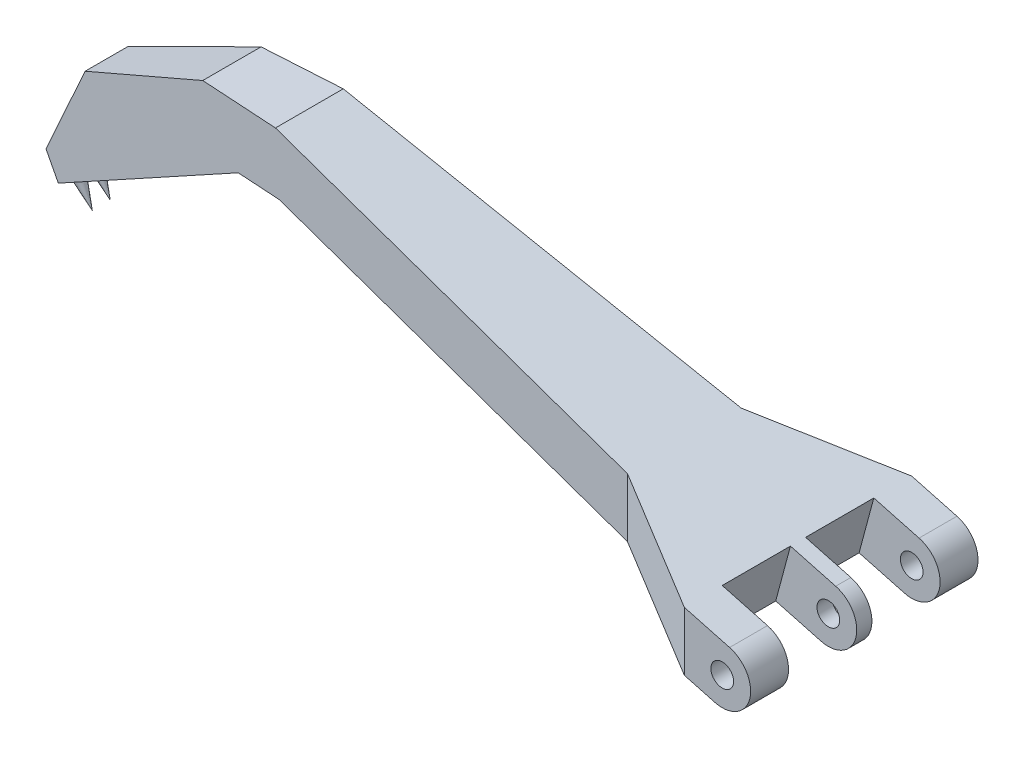
ISO-10303-21;
HEADER;
FILE_DESCRIPTION(('STEP AP214'),'2;1');
FILE_NAME('part.step','',(''),(''),'','','');
FILE_SCHEMA(('AUTOMOTIVE_DESIGN { 1 0 10303 214 1 1 1 1 }'));
ENDSEC;
DATA;
#1=APPLICATION_CONTEXT('core data for automotive mechanical design processes');
#2=APPLICATION_PROTOCOL_DEFINITION('international standard','automotive_design',2000,#1);
#3=PRODUCT_CONTEXT('',#1,'mechanical');
#4=PRODUCT('Part','Part','',(#3));
#5=PRODUCT_RELATED_PRODUCT_CATEGORY('part','',(#4));
#6=PRODUCT_DEFINITION_FORMATION('','',#4);
#7=PRODUCT_DEFINITION_CONTEXT('part definition',#1,'design');
#8=PRODUCT_DEFINITION('design','',#6,#7);
#9=PRODUCT_DEFINITION_SHAPE('','',#8);
#10=(LENGTH_UNIT() NAMED_UNIT(*) SI_UNIT(.MILLI.,.METRE.));
#11=(NAMED_UNIT(*) PLANE_ANGLE_UNIT() SI_UNIT($,.RADIAN.));
#12=(NAMED_UNIT(*) SI_UNIT($,.STERADIAN.) SOLID_ANGLE_UNIT());
#13=UNCERTAINTY_MEASURE_WITH_UNIT(LENGTH_MEASURE(1.E-05),#10,'distance_accuracy_value','');
#14=(GEOMETRIC_REPRESENTATION_CONTEXT(3) GLOBAL_UNCERTAINTY_ASSIGNED_CONTEXT((#13)) GLOBAL_UNIT_ASSIGNED_CONTEXT((#10,
#11,#12)) REPRESENTATION_CONTEXT('',''));
#15=CARTESIAN_POINT('',(0.,0.,0.));
#16=DIRECTION('',(0.,0.,1.));
#17=DIRECTION('',(1.,0.,0.));
#18=AXIS2_PLACEMENT_3D('',#15,#16,#17);
#19=CARTESIAN_POINT('',(0.,0.,15.));
#20=DIRECTION('',(0.,0.,-1.));
#21=DIRECTION('',(0.,1.,0.));
#22=AXIS2_PLACEMENT_3D('',#19,#20,#21);
#23=CYLINDRICAL_SURFACE('',#22,3.75);
#24=DIRECTION('',(0.,0.,-1.));
#25=VECTOR('',#24,1.);
#26=CARTESIAN_POINT('',(-0.970571419134456,-3.62222184858401,15.));
#27=LINE('',#26,#25);
#28=CARTESIAN_POINT('',(-0.970571419134456,-3.62222184858401,15.));
#29=VERTEX_POINT('',#28);
#30=CARTESIAN_POINT('',(-0.970571419134455,-3.622221848584,10.));
#31=VERTEX_POINT('',#30);
#32=EDGE_CURVE('E471',#29,#31,#27,.T.);
#33=ORIENTED_EDGE('',*,*,#32,.T.);
#34=CARTESIAN_POINT('',(0.,0.,10.));
#35=DIRECTION('',(0.,0.,1.));
#36=DIRECTION('',(1.,0.,0.));
#37=AXIS2_PLACEMENT_3D('',#34,#35,#36);
#38=CIRCLE('',#37,3.75);
#39=CARTESIAN_POINT('',(0.970571419134456,3.62222184858401,10.));
#40=VERTEX_POINT('',#39);
#41=EDGE_CURVE('E441',#31,#40,#38,.T.);
#42=ORIENTED_EDGE('',*,*,#41,.T.);
#43=DIRECTION('',(0.,0.,-1.));
#44=VECTOR('',#43,1.);
#45=CARTESIAN_POINT('',(0.970571419134455,3.622221848584,15.));
#46=LINE('',#45,#44);
#47=CARTESIAN_POINT('',(0.970571419134455,3.622221848584,15.));
#48=VERTEX_POINT('',#47);
#49=EDGE_CURVE('E466',#48,#40,#46,.T.);
#50=ORIENTED_EDGE('',*,*,#49,.F.);
#51=CARTESIAN_POINT('',(0.,0.,15.));
#52=DIRECTION('',(0.,0.,1.));
#53=DIRECTION('',(1.,0.,0.));
#54=AXIS2_PLACEMENT_3D('',#51,#52,#53);
#55=CIRCLE('',#54,3.75);
#56=EDGE_CURVE('E463',#29,#48,#55,.T.);
#57=ORIENTED_EDGE('',*,*,#56,.F.);
#58=EDGE_LOOP('',(#33,#42,#50,#57));
#59=FACE_BOUND('',#58,.T.);
#60=ADVANCED_FACE('F228',(#59),#23,.T.);
#61=CARTESIAN_POINT('',(0.,0.,-10.));
#62=DIRECTION('',(0.,0.,1.));
#63=DIRECTION('',(1.,0.,0.));
#64=AXIS2_PLACEMENT_3D('',#61,#62,#63);
#65=CIRCLE('',#64,3.75);
#66=CARTESIAN_POINT('',(-0.970571419134455,-3.622221848584,-10.));
#67=VERTEX_POINT('',#66);
#68=CARTESIAN_POINT('',(0.970571419134455,3.62222184858401,-10.));
#69=VERTEX_POINT('',#68);
#70=EDGE_CURVE('E434',#67,#69,#65,.T.);
#71=ORIENTED_EDGE('',*,*,#70,.F.);
#72=CARTESIAN_POINT('',(-0.970571419134456,-3.622221848584,-15.));
#73=VERTEX_POINT('',#72);
#74=EDGE_CURVE('E469',#67,#73,#27,.T.);
#75=ORIENTED_EDGE('',*,*,#74,.T.);
#76=CARTESIAN_POINT('',(0.,0.,-15.));
#77=DIRECTION('',(0.,0.,1.));
#78=DIRECTION('',(1.,0.,0.));
#79=AXIS2_PLACEMENT_3D('',#76,#77,#78);
#80=CIRCLE('',#79,3.75);
#81=CARTESIAN_POINT('',(0.970571419134455,3.62222184858401,-15.));
#82=VERTEX_POINT('',#81);
#83=EDGE_CURVE('E452',#73,#82,#80,.T.);
#84=ORIENTED_EDGE('',*,*,#83,.T.);
#85=EDGE_CURVE('E465',#69,#82,#46,.T.);
#86=ORIENTED_EDGE('',*,*,#85,.F.);
#87=EDGE_LOOP('',(#71,#75,#84,#86));
#88=FACE_BOUND('',#87,.T.);
#89=ADVANCED_FACE('F592',(#88),#23,.T.);
#90=CARTESIAN_POINT('',(0.,0.,15.));
#91=DIRECTION('',(0.,0.,-1.));
#92=DIRECTION('',(0.,1.,0.));
#93=AXIS2_PLACEMENT_3D('',#90,#91,#92);
#94=CYLINDRICAL_SURFACE('',#93,1.5);
#95=CARTESIAN_POINT('',(0.,0.,10.));
#96=DIRECTION('',(0.,0.,1.));
#97=DIRECTION('',(1.,0.,0.));
#98=AXIS2_PLACEMENT_3D('',#95,#96,#97);
#99=CIRCLE('',#98,1.5);
#100=CARTESIAN_POINT('',(1.5,0.,10.));
#101=VERTEX_POINT('',#100);
#102=EDGE_CURVE('E232',#101,#101,#99,.T.);
#103=ORIENTED_EDGE('',*,*,#102,.F.);
#104=EDGE_LOOP('',(#103));
#105=FACE_BOUND('',#104,.T.);
#106=CARTESIAN_POINT('',(0.,0.,15.));
#107=DIRECTION('',(0.,0.,1.));
#108=DIRECTION('',(1.,0.,0.));
#109=AXIS2_PLACEMENT_3D('',#106,#107,#108);
#110=CIRCLE('',#109,1.5);
#111=CARTESIAN_POINT('',(1.5,0.,15.));
#112=VERTEX_POINT('',#111);
#113=EDGE_CURVE('E455',#112,#112,#110,.T.);
#114=ORIENTED_EDGE('',*,*,#113,.T.);
#115=EDGE_LOOP('',(#114));
#116=FACE_BOUND('',#115,.T.);
#117=ADVANCED_FACE('F567',(#105,#116),#94,.F.);
#118=CARTESIAN_POINT('',(0.,0.,-15.));
#119=DIRECTION('',(0.,0.,1.));
#120=DIRECTION('',(1.,0.,0.));
#121=AXIS2_PLACEMENT_3D('',#118,#119,#120);
#122=CIRCLE('',#121,1.5);
#123=CARTESIAN_POINT('',(1.5,0.,-15.));
#124=VERTEX_POINT('',#123);
#125=EDGE_CURVE('E443',#124,#124,#122,.T.);
#126=ORIENTED_EDGE('',*,*,#125,.F.);
#127=EDGE_LOOP('',(#126));
#128=FACE_BOUND('',#127,.T.);
#129=CARTESIAN_POINT('',(0.,0.,-10.));
#130=DIRECTION('',(0.,0.,1.));
#131=DIRECTION('',(1.,0.,0.));
#132=AXIS2_PLACEMENT_3D('',#129,#130,#131);
#133=CIRCLE('',#132,1.5);
#134=CARTESIAN_POINT('',(1.5,0.,-10.));
#135=VERTEX_POINT('',#134);
#136=EDGE_CURVE('E402',#135,#135,#133,.T.);
#137=ORIENTED_EDGE('',*,*,#136,.T.);
#138=EDGE_LOOP('',(#137));
#139=FACE_BOUND('',#138,.T.);
#140=ADVANCED_FACE('F568',(#128,#139),#94,.F.);
#141=CARTESIAN_POINT('',(-68.9705714191345,14.5983232367324,-15.));
#142=DIRECTION('',(-0.258819045102521,-0.965925826289068,0.));
#143=DIRECTION('',(0.965925826289068,-0.258819045102521,0.));
#144=AXIS2_PLACEMENT_3D('',#141,#142,#143);
#145=PLANE('',#144);
#146=DIRECTION('',(0.965925826289068,-0.258819045102521,0.));
#147=VECTOR('',#146,1.);
#148=CARTESIAN_POINT('',(-0.970571419134447,-3.62222184858401,10.));
#149=LINE('',#148,#147);
#150=CARTESIAN_POINT('',(-6.94114283826891,-2.02241205847458,10.));
#151=VERTEX_POINT('',#150);
#152=EDGE_CURVE('E394',#151,#31,#149,.T.);
#153=ORIENTED_EDGE('',*,*,#152,.T.);
#154=ORIENTED_EDGE('',*,*,#32,.F.);
#155=DIRECTION('',(0.965925826289068,-0.258819045102524,0.));
#156=VECTOR('',#155,1.);
#157=CARTESIAN_POINT('',(-0.970571419134456,-3.62222184858401,15.));
#158=LINE('',#157,#156);
#159=CARTESIAN_POINT('',(-5.,-2.54253971438219,15.));
#160=VERTEX_POINT('',#159);
#161=EDGE_CURVE('E461',#160,#29,#158,.T.);
#162=ORIENTED_EDGE('',*,*,#161,.F.);
#163=DIRECTION('',(0.869796502294152,-0.233061270369134,0.434898251147076));
#164=VECTOR('',#163,1.);
#165=CARTESIAN_POINT('',(-68.2195914821881,14.3970987690956,-16.609795741094));
#166=LINE('',#165,#164);
#167=CARTESIAN_POINT('',(-20.,1.47669817208466,7.5));
#168=VERTEX_POINT('',#167);
#169=EDGE_CURVE('E492',#168,#160,#166,.T.);
#170=ORIENTED_EDGE('',*,*,#169,.F.);
#171=DIRECTION('',(0.964243845481214,-0.258368359703372,0.058988110291729));
#172=VECTOR('',#171,1.);
#173=CARTESIAN_POINT('',(-70.0799493099778,14.8955801466848,4.43633349370575));
#174=LINE('',#173,#172);
#175=CARTESIAN_POINT('',(-68.9705714191345,14.5983232367324,4.50420025343353));
#176=VERTEX_POINT('',#175);
#177=EDGE_CURVE('E528',#176,#168,#174,.T.);
#178=ORIENTED_EDGE('',*,*,#177,.F.);
#179=DIRECTION('',(0.,0.,1.));
#180=VECTOR('',#179,1.);
#181=CARTESIAN_POINT('',(-68.9705714191345,14.5983232367324,-15.));
#182=LINE('',#181,#180);
#183=CARTESIAN_POINT('',(-68.9705714191345,14.5983232367324,-4.50420025343353));
#184=VERTEX_POINT('',#183);
#185=EDGE_CURVE('E531',#184,#176,#182,.T.);
#186=ORIENTED_EDGE('',*,*,#185,.F.);
#187=DIRECTION('',(0.964243845481214,-0.258368359703372,-0.058988110291729));
#188=VECTOR('',#187,1.);
#189=CARTESIAN_POINT('',(-68.3735816408168,14.4383603077425,-4.54072140837942));
#190=LINE('',#189,#188);
#191=CARTESIAN_POINT('',(-20.,1.47669817208466,-7.5));
#192=VERTEX_POINT('',#191);
#193=EDGE_CURVE('E515',#184,#192,#190,.T.);
#194=ORIENTED_EDGE('',*,*,#193,.T.);
#195=DIRECTION('',(0.869796502294152,-0.233061270369134,-0.434898251147076));
#196=VECTOR('',#195,1.);
#197=CARTESIAN_POINT('',(-56.871402151141,11.3563606022861,10.9357010755705));
#198=LINE('',#197,#196);
#199=CARTESIAN_POINT('',(-5.,-2.54253971438218,-15.));
#200=VERTEX_POINT('',#199);
#201=EDGE_CURVE('E497',#192,#200,#198,.T.);
#202=ORIENTED_EDGE('',*,*,#201,.T.);
#203=DIRECTION('',(0.965925826289068,-0.258819045102524,0.));
#204=VECTOR('',#203,1.);
#205=CARTESIAN_POINT('',(-0.970571419134456,-3.622221848584,-15.));
#206=LINE('',#205,#204);
#207=EDGE_CURVE('E449',#200,#73,#206,.T.);
#208=ORIENTED_EDGE('',*,*,#207,.T.);
#209=ORIENTED_EDGE('',*,*,#74,.F.);
#210=DIRECTION('',(0.965925826289068,-0.258819045102521,0.));
#211=VECTOR('',#210,1.);
#212=CARTESIAN_POINT('',(-0.970571419134449,-3.62222184858401,-10.));
#213=LINE('',#212,#211);
#214=CARTESIAN_POINT('',(-6.94114283826892,-2.02241205847458,-10.));
#215=VERTEX_POINT('',#214);
#216=EDGE_CURVE('E389',#215,#67,#213,.T.);
#217=ORIENTED_EDGE('',*,*,#216,.F.);
#218=DIRECTION('',(0.,0.,1.));
#219=VECTOR('',#218,1.);
#220=CARTESIAN_POINT('',(-6.94114283826891,-2.02241205847458,0.));
#221=LINE('',#220,#219);
#222=CARTESIAN_POINT('',(-6.94114283826891,-2.02241205847458,-0.999999999999999));
#223=VERTEX_POINT('',#222);
#224=EDGE_CURVE('E418',#215,#223,#221,.T.);
#225=ORIENTED_EDGE('',*,*,#224,.T.);
#226=DIRECTION('',(0.965925826289068,-0.258819045102521,0.));
#227=VECTOR('',#226,1.);
#228=CARTESIAN_POINT('',(-0.970571419134448,-3.62222184858401,-0.999999999999999));
#229=LINE('',#228,#227);
#230=CARTESIAN_POINT('',(-0.970571419134455,-3.622221848584,-0.999999999999997));
#231=VERTEX_POINT('',#230);
#232=EDGE_CURVE('E429',#223,#231,#229,.T.);
#233=ORIENTED_EDGE('',*,*,#232,.T.);
#234=CARTESIAN_POINT('',(-0.970571419134456,-3.62222184858401,1.));
#235=VERTEX_POINT('',#234);
#236=EDGE_CURVE('E475',#235,#231,#27,.T.);
#237=ORIENTED_EDGE('',*,*,#236,.F.);
#238=DIRECTION('',(-0.965925826289068,0.258819045102521,0.));
#239=VECTOR('',#238,1.);
#240=CARTESIAN_POINT('',(-0.970571419134447,-3.62222184858401,1.));
#241=LINE('',#240,#239);
#242=CARTESIAN_POINT('',(-6.94114283826891,-2.02241205847458,1.));
#243=VERTEX_POINT('',#242);
#244=EDGE_CURVE('E406',#235,#243,#241,.T.);
#245=ORIENTED_EDGE('',*,*,#244,.T.);
#246=DIRECTION('',(0.,0.,-1.));
#247=VECTOR('',#246,1.);
#248=CARTESIAN_POINT('',(-6.94114283826891,-2.02241205847458,0.));
#249=LINE('',#248,#247);
#250=EDGE_CURVE('E398',#151,#243,#249,.T.);
#251=ORIENTED_EDGE('',*,*,#250,.F.);
#252=EDGE_LOOP('',(#153,#154,#162,#170,#178,#186,#194,#202,#208,#209,#217,#225,#233,#237,#245,#251));
#253=FACE_BOUND('',#252,.T.);
#254=ADVANCED_FACE('F585',(#253),#145,.T.);
#255=CARTESIAN_POINT('',(-74.7149624486662,14.5983232367324,-15.));
#256=DIRECTION('',(0.,-1.,0.));
#257=DIRECTION('',(0.,0.,-1.));
#258=AXIS2_PLACEMENT_3D('',#255,#256,#257);
#259=PLANE('',#258);
#260=DIRECTION('',(0.998134014285676,0.,0.0610613586973179));
#261=VECTOR('',#260,1.);
#262=CARTESIAN_POINT('',(-75.8822752134345,14.5983232367324,4.08137323967286));
#263=LINE('',#262,#261);
#264=CARTESIAN_POINT('',(-74.7149624486662,14.5983232367324,4.1527841949367));
#265=VERTEX_POINT('',#264);
#266=EDGE_CURVE('E526',#265,#176,#263,.T.);
#267=ORIENTED_EDGE('',*,*,#266,.F.);
#268=DIRECTION('',(0.,0.,1.));
#269=VECTOR('',#268,1.);
#270=CARTESIAN_POINT('',(-74.7149624486662,14.5983232367324,-15.));
#271=LINE('',#270,#269);
#272=CARTESIAN_POINT('',(-74.7149624486662,14.5983232367324,-4.1527841949367));
#273=VERTEX_POINT('',#272);
#274=EDGE_CURVE('E534',#273,#265,#271,.T.);
#275=ORIENTED_EDGE('',*,*,#274,.F.);
#276=DIRECTION('',(0.998134014285676,0.,-0.0610613586973179));
#277=VECTOR('',#276,1.);
#278=CARTESIAN_POINT('',(-74.0538526412058,14.5983232367324,-4.19322792545173));
#279=LINE('',#278,#277);
#280=EDGE_CURVE('E512',#273,#184,#279,.T.);
#281=ORIENTED_EDGE('',*,*,#280,.T.);
#282=ORIENTED_EDGE('',*,*,#185,.T.);
#283=EDGE_LOOP('',(#267,#275,#281,#282));
#284=FACE_BOUND('',#283,.T.);
#285=ADVANCED_FACE('F648',(#284),#259,.T.);
#286=CARTESIAN_POINT('',(-100.,0.,-15.));
#287=DIRECTION('',(0.500000000000001,-0.866025403784438,0.));
#288=DIRECTION('',(0.866025403784438,0.500000000000001,0.));
#289=AXIS2_PLACEMENT_3D('',#286,#287,#288);
#290=PLANE('',#289);
#291=CARTESIAN_POINT('',(-98.7009618943233,0.750000000000008,-1.18332476496804));
#292=DIRECTION('',(0.500000000000002,-0.866025403784438,0.));
#293=DIRECTION('',(0.866025403784438,0.500000000000002,0.));
#294=AXIS2_PLACEMENT_3D('',#291,#292,#293);
#295=CIRCLE('',#294,0.749999999999999);
#296=CARTESIAN_POINT('',(-98.051442841485,1.12500000000001,-1.18332476496804));
#297=VERTEX_POINT('',#296);
#298=EDGE_CURVE('E384',#297,#297,#295,.T.);
#299=ORIENTED_EDGE('',*,*,#298,.F.);
#300=EDGE_LOOP('',(#299));
#301=FACE_BOUND('',#300,.T.);
#302=CARTESIAN_POINT('',(-98.7009618943233,0.750000000000008,1.18332476496804));
#303=DIRECTION('',(0.500000000000002,-0.866025403784438,0.));
#304=DIRECTION('',(0.866025403784438,0.500000000000002,0.));
#305=AXIS2_PLACEMENT_3D('',#302,#303,#304);
#306=CIRCLE('',#305,0.749999999999999);
#307=CARTESIAN_POINT('',(-98.051442841485,1.12500000000001,1.18332476496804));
#308=VERTEX_POINT('',#307);
#309=EDGE_CURVE('E386',#308,#308,#306,.T.);
#310=ORIENTED_EDGE('',*,*,#309,.F.);
#311=EDGE_LOOP('',(#310));
#312=FACE_BOUND('',#311,.T.);
#313=DIRECTION('',(0.864812562293368,0.499299765638648,0.0529053507007609));
#314=VECTOR('',#313,1.);
#315=CARTESIAN_POINT('',(-100.805529177096,-0.465072487236377,2.5566804345002));
#316=LINE('',#315,#314);
#317=CARTESIAN_POINT('',(-100.,0.,2.60595909379827));
#318=VERTEX_POINT('',#317);
#319=EDGE_CURVE('E524',#318,#265,#316,.T.);
#320=ORIENTED_EDGE('',*,*,#319,.F.);
#321=DIRECTION('',(0.,0.,1.));
#322=VECTOR('',#321,1.);
#323=CARTESIAN_POINT('',(-100.,0.,-15.));
#324=LINE('',#323,#322);
#325=CARTESIAN_POINT('',(-100.,0.,-2.60595909379827));
#326=VERTEX_POINT('',#325);
#327=EDGE_CURVE('E537',#326,#318,#324,.T.);
#328=ORIENTED_EDGE('',*,*,#327,.F.);
#329=DIRECTION('',(0.864812562293368,0.499299765638648,-0.0529053507007609));
#330=VECTOR('',#329,1.);
#331=CARTESIAN_POINT('',(-99.4329328201392,0.327396388941235,-2.64064971848331));
#332=LINE('',#331,#330);
#333=EDGE_CURVE('E509',#326,#273,#332,.T.);
#334=ORIENTED_EDGE('',*,*,#333,.T.);
#335=ORIENTED_EDGE('',*,*,#274,.T.);
#336=EDGE_LOOP('',(#320,#328,#334,#335));
#337=FACE_BOUND('',#336,.T.);
#338=ADVANCED_FACE('F644',(#301,#312,#337),#290,.T.);
#339=CARTESIAN_POINT('',(-101.732050807569,3.,-15.));
#340=DIRECTION('',(-0.866025403784438,-0.500000000000002,0.));
#341=DIRECTION('',(0.500000000000002,-0.866025403784438,0.));
#342=AXIS2_PLACEMENT_3D('',#339,#340,#341);
#343=PLANE('',#342);
#344=DIRECTION('',(0.499766261304419,-0.865620556487993,0.0305734565795416));
#345=VECTOR('',#344,1.);
#346=CARTESIAN_POINT('',(-101.999443494142,3.46313771871753,2.48364211567363));
#347=LINE('',#346,#345);
#348=CARTESIAN_POINT('',(-101.732050807569,3.00000000000003,2.5));
#349=VERTEX_POINT('',#348);
#350=EDGE_CURVE('E522',#349,#318,#347,.T.);
#351=ORIENTED_EDGE('',*,*,#350,.F.);
#352=DIRECTION('',(0.,0.,1.));
#353=VECTOR('',#352,1.);
#354=CARTESIAN_POINT('',(-101.732050807569,3.,-15.));
#355=LINE('',#354,#353);
#356=CARTESIAN_POINT('',(-101.732050807569,3.,-2.5));
#357=VERTEX_POINT('',#356);
#358=EDGE_CURVE('E540',#357,#349,#355,.T.);
#359=ORIENTED_EDGE('',*,*,#358,.F.);
#360=DIRECTION('',(0.499766261304419,-0.865620556487993,-0.0305734565795416));
#361=VECTOR('',#360,1.);
#362=CARTESIAN_POINT('',(-101.541056031445,2.6691873437732,-2.51168420309026));
#363=LINE('',#362,#361);
#364=EDGE_CURVE('E506',#357,#326,#363,.T.);
#365=ORIENTED_EDGE('',*,*,#364,.T.);
#366=ORIENTED_EDGE('',*,*,#327,.T.);
#367=EDGE_LOOP('',(#351,#359,#365,#366));
#368=FACE_BOUND('',#367,.T.);
#369=ADVANCED_FACE('F641',(#368),#343,.T.);
#370=CARTESIAN_POINT('',(-96.2340080507036,14.790590741355,-15.));
#371=DIRECTION('',(-0.90630778703665,0.4226182617407,0.));
#372=DIRECTION('',(-0.4226182617407,-0.90630778703665,0.));
#373=AXIS2_PLACEMENT_3D('',#370,#371,#372);
#374=PLANE('',#373);
#375=DIRECTION('',(-0.422477088512507,-0.906005040071799,-0.0258452519139152));
#376=VECTOR('',#375,1.);
#377=CARTESIAN_POINT('',(-96.428763585724,14.3729361486963,2.82443130751307));
#378=LINE('',#377,#376);
#379=CARTESIAN_POINT('',(-96.2340080507036,14.790590741355,2.8363455769518));
#380=VERTEX_POINT('',#379);
#381=EDGE_CURVE('E520',#380,#349,#378,.T.);
#382=ORIENTED_EDGE('',*,*,#381,.F.);
#383=DIRECTION('',(0.,0.,1.));
#384=VECTOR('',#383,1.);
#385=CARTESIAN_POINT('',(-96.2340080507036,14.790590741355,-15.));
#386=LINE('',#385,#384);
#387=CARTESIAN_POINT('',(-96.2340080507036,14.790590741355,-2.83634557695181));
#388=VERTEX_POINT('',#387);
#389=EDGE_CURVE('E543',#388,#380,#386,.T.);
#390=ORIENTED_EDGE('',*,*,#389,.F.);
#391=DIRECTION('',(-0.422477088512507,-0.906005040071799,0.0258452519139152));
#392=VECTOR('',#391,1.);
#393=CARTESIAN_POINT('',(-96.1011927823101,15.0754140035743,-2.84447061890789));
#394=LINE('',#393,#392);
#395=EDGE_CURVE('E503',#388,#357,#394,.T.);
#396=ORIENTED_EDGE('',*,*,#395,.T.);
#397=ORIENTED_EDGE('',*,*,#358,.T.);
#398=EDGE_LOOP('',(#382,#390,#396,#397));
#399=FACE_BOUND('',#398,.T.);
#400=ADVANCED_FACE('F636',(#399),#374,.T.);
#401=CARTESIAN_POINT('',(-79.701126542499,22.5,-15.));
#402=DIRECTION('',(-0.422618261740701,0.906307787036649,0.));
#403=DIRECTION('',(-0.906307787036649,-0.422618261740701,0.));
#404=AXIS2_PLACEMENT_3D('',#401,#402,#403);
#405=PLANE('',#404);
#406=DIRECTION('',(-0.904917986450531,-0.421970187084086,-0.0553588205305825));
#407=VECTOR('',#406,1.);
#408=CARTESIAN_POINT('',(-80.6453083583222,22.059720788591,3.78999225156442));
#409=LINE('',#408,#407);
#410=CARTESIAN_POINT('',(-79.701126542499,22.5,3.84775305693355));
#411=VERTEX_POINT('',#410);
#412=EDGE_CURVE('E518',#411,#380,#409,.T.);
#413=ORIENTED_EDGE('',*,*,#412,.F.);
#414=DIRECTION('',(0.,0.,1.));
#415=VECTOR('',#414,1.);
#416=CARTESIAN_POINT('',(-79.701126542499,22.5,-15.));
#417=LINE('',#416,#415);
#418=CARTESIAN_POINT('',(-79.701126542499,22.5,-3.84775305693355));
#419=VERTEX_POINT('',#418);
#420=EDGE_CURVE('E546',#419,#411,#417,.T.);
#421=ORIENTED_EDGE('',*,*,#420,.F.);
#422=DIRECTION('',(-0.904917986450531,-0.421970187084086,0.0553588205305825));
#423=VECTOR('',#422,1.);
#424=CARTESIAN_POINT('',(-79.1424525861178,22.7605139442723,-3.88193022188054));
#425=LINE('',#424,#423);
#426=EDGE_CURVE('E500',#419,#388,#425,.T.);
#427=ORIENTED_EDGE('',*,*,#426,.T.);
#428=ORIENTED_EDGE('',*,*,#389,.T.);
#429=EDGE_LOOP('',(#413,#421,#427,#428));
#430=FACE_BOUND('',#429,.T.);
#431=ADVANCED_FACE('F633',(#430),#405,.T.);
#432=CARTESIAN_POINT('',(-69.4822557759636,22.5,-15.));
#433=DIRECTION('',(0.,1.,0.));
#434=DIRECTION('',(0.,0.,1.));
#435=AXIS2_PLACEMENT_3D('',#432,#433,#434);
#436=PLANE('',#435);
#437=DIRECTION('',(0.998134014285676,0.,0.0610613586973179));
#438=VECTOR('',#437,1.);
#439=CARTESIAN_POINT('',(-0.531675433576437,22.5,8.69098471004111));
#440=LINE('',#439,#438);
#441=CARTESIAN_POINT('',(-69.4822557759636,22.5,4.47289770126622));
#442=VERTEX_POINT('',#441);
#443=EDGE_CURVE('E474',#411,#442,#440,.T.);
#444=ORIENTED_EDGE('',*,*,#443,.T.);
#445=DIRECTION('',(0.,0.,1.));
#446=VECTOR('',#445,1.);
#447=CARTESIAN_POINT('',(-69.4822557759636,22.5,-15.));
#448=LINE('',#447,#446);
#449=CARTESIAN_POINT('',(-69.4822557759636,22.5,-4.47289770126622));
#450=VERTEX_POINT('',#449);
#451=EDGE_CURVE('E530',#450,#442,#448,.T.);
#452=ORIENTED_EDGE('',*,*,#451,.F.);
#453=DIRECTION('',(0.998134014285676,0.,-0.0610613586973179));
#454=VECTOR('',#453,1.);
#455=CARTESIAN_POINT('',(-0.531675433576437,22.5,-8.69098471004111));
#456=LINE('',#455,#454);
#457=EDGE_CURVE('E253',#419,#450,#456,.T.);
#458=ORIENTED_EDGE('',*,*,#457,.F.);
#459=ORIENTED_EDGE('',*,*,#420,.T.);
#460=EDGE_LOOP('',(#444,#452,#458,#459));
#461=FACE_BOUND('',#460,.T.);
#462=ADVANCED_FACE('F628',(#461),#436,.T.);
#463=CARTESIAN_POINT('',(0.970571419134455,3.62222184858401,-15.));
#464=DIRECTION('',(0.258819045102521,0.965925826289068,0.));
#465=DIRECTION('',(-0.965925826289068,0.258819045102521,0.));
#466=AXIS2_PLACEMENT_3D('',#463,#464,#465);
#467=PLANE('',#466);
#468=DIRECTION('',(0.965925826289068,-0.258819045102521,0.));
#469=VECTOR('',#468,1.);
#470=CARTESIAN_POINT('',(0.970571419134457,3.62222184858401,10.));
#471=LINE('',#470,#469);
#472=CARTESIAN_POINT('',(-5.00000000000001,5.22203163869343,10.));
#473=VERTEX_POINT('',#472);
#474=EDGE_CURVE('E395',#473,#40,#471,.T.);
#475=ORIENTED_EDGE('',*,*,#474,.F.);
#476=DIRECTION('',(0.,0.,-1.));
#477=VECTOR('',#476,1.);
#478=CARTESIAN_POINT('',(-5.,5.22203163869344,0.));
#479=LINE('',#478,#477);
#480=CARTESIAN_POINT('',(-5.00000000000001,5.22203163869343,1.));
#481=VERTEX_POINT('',#480);
#482=EDGE_CURVE('E399',#473,#481,#479,.T.);
#483=ORIENTED_EDGE('',*,*,#482,.T.);
#484=DIRECTION('',(-0.965925826289068,0.258819045102521,0.));
#485=VECTOR('',#484,1.);
#486=CARTESIAN_POINT('',(0.970571419134456,3.62222184858401,1.));
#487=LINE('',#486,#485);
#488=CARTESIAN_POINT('',(0.970571419134456,3.62222184858401,1.));
#489=VERTEX_POINT('',#488);
#490=EDGE_CURVE('E392',#489,#481,#487,.T.);
#491=ORIENTED_EDGE('',*,*,#490,.F.);
#492=CARTESIAN_POINT('',(0.970571419134456,3.62222184858401,-0.999999999999997));
#493=VERTEX_POINT('',#492);
#494=EDGE_CURVE('E470',#489,#493,#46,.T.);
#495=ORIENTED_EDGE('',*,*,#494,.T.);
#496=DIRECTION('',(0.965925826289068,-0.258819045102521,0.));
#497=VECTOR('',#496,1.);
#498=CARTESIAN_POINT('',(0.970571419134456,3.62222184858401,-0.999999999999999));
#499=LINE('',#498,#497);
#500=CARTESIAN_POINT('',(-5.00000000000001,5.22203163869343,-0.999999999999999));
#501=VERTEX_POINT('',#500);
#502=EDGE_CURVE('E415',#501,#493,#499,.T.);
#503=ORIENTED_EDGE('',*,*,#502,.F.);
#504=DIRECTION('',(0.,0.,1.));
#505=VECTOR('',#504,1.);
#506=CARTESIAN_POINT('',(-5.,5.22203163869344,0.));
#507=LINE('',#506,#505);
#508=CARTESIAN_POINT('',(-5.00000000000001,5.22203163869343,-10.));
#509=VERTEX_POINT('',#508);
#510=EDGE_CURVE('E419',#509,#501,#507,.T.);
#511=ORIENTED_EDGE('',*,*,#510,.F.);
#512=DIRECTION('',(0.965925826289068,-0.258819045102521,0.));
#513=VECTOR('',#512,1.);
#514=CARTESIAN_POINT('',(0.970571419134454,3.62222184858401,-10.));
#515=LINE('',#514,#513);
#516=EDGE_CURVE('E408',#509,#69,#515,.T.);
#517=ORIENTED_EDGE('',*,*,#516,.T.);
#518=ORIENTED_EDGE('',*,*,#85,.T.);
#519=DIRECTION('',(-0.965925826289068,0.258819045102522,0.));
#520=VECTOR('',#519,1.);
#521=CARTESIAN_POINT('',(0.970571419134455,3.62222184858401,-15.));
#522=LINE('',#521,#520);
#523=CARTESIAN_POINT('',(-5.,5.22203163869344,-15.));
#524=VERTEX_POINT('',#523);
#525=EDGE_CURVE('E446',#82,#524,#522,.T.);
#526=ORIENTED_EDGE('',*,*,#525,.T.);
#527=DIRECTION('',(-0.869796502294152,0.233061270369133,0.434898251147076));
#528=VECTOR('',#527,1.);
#529=CARTESIAN_POINT('',(-0.158681495513486,3.92480425511442,-17.4206592522433));
#530=LINE('',#529,#528);
#531=CARTESIAN_POINT('',(-20.,9.24126952516028,-7.5));
#532=VERTEX_POINT('',#531);
#533=EDGE_CURVE('E494',#524,#532,#530,.T.);
#534=ORIENTED_EDGE('',*,*,#533,.T.);
#535=DIRECTION('',(-0.964243845481214,0.258368359703372,0.058988110291729));
#536=VECTOR('',#535,1.);
#537=CARTESIAN_POINT('',(1.32419419575941,3.5274689111621,-8.80451848357295));
#538=LINE('',#537,#536);
#539=EDGE_CURVE('E237',#532,#450,#538,.T.);
#540=ORIENTED_EDGE('',*,*,#539,.T.);
#541=ORIENTED_EDGE('',*,*,#451,.T.);
#542=DIRECTION('',(-0.964243845481214,0.258368359703372,-0.058988110291729));
#543=VECTOR('',#542,1.);
#544=CARTESIAN_POINT('',(-0.382173473401592,3.98468875010437,8.70013056889928));
#545=LINE('',#544,#543);
#546=CARTESIAN_POINT('',(-20.,9.24126952516028,7.5));
#547=VERTEX_POINT('',#546);
#548=EDGE_CURVE('E13',#547,#442,#545,.T.);
#549=ORIENTED_EDGE('',*,*,#548,.F.);
#550=DIRECTION('',(-0.869796502294152,0.233061270369134,-0.434898251147076));
#551=VECTOR('',#550,1.);
#552=CARTESIAN_POINT('',(-11.5068708265606,6.96554242192397,11.7465645867197));
#553=LINE('',#552,#551);
#554=CARTESIAN_POINT('',(-5.,5.22203163869344,15.));
#555=VERTEX_POINT('',#554);
#556=EDGE_CURVE('E490',#555,#547,#553,.T.);
#557=ORIENTED_EDGE('',*,*,#556,.F.);
#558=DIRECTION('',(-0.965925826289068,0.258819045102522,0.));
#559=VECTOR('',#558,1.);
#560=CARTESIAN_POINT('',(0.970571419134455,3.622221848584,15.));
#561=LINE('',#560,#559);
#562=EDGE_CURVE('E458',#48,#555,#561,.T.);
#563=ORIENTED_EDGE('',*,*,#562,.F.);
#564=ORIENTED_EDGE('',*,*,#49,.T.);
#565=EDGE_LOOP('',(#475,#483,#491,#495,#503,#511,#517,#518,#526,#534,#540,#541,#549,#557,#563,#564));
#566=FACE_BOUND('',#565,.T.);
#567=ADVANCED_FACE('F230',(#566),#467,.T.);
#568=CARTESIAN_POINT('',(-0.531675433576437,22.5,8.69098471004111));
#569=DIRECTION('',(0.0610613586973179,0.,-0.998134014285676));
#570=DIRECTION('',(-0.998134014285676,0.,-0.0610613586973179));
#571=AXIS2_PLACEMENT_3D('',#568,#569,#570);
#572=PLANE('',#571);
#573=ORIENTED_EDGE('',*,*,#177,.T.);
#574=DIRECTION('',(0.,-1.,0.));
#575=VECTOR('',#574,1.);
#576=CARTESIAN_POINT('',(-20.,22.5,7.5));
#577=LINE('',#576,#575);
#578=EDGE_CURVE('E487',#547,#168,#577,.T.);
#579=ORIENTED_EDGE('',*,*,#578,.F.);
#580=ORIENTED_EDGE('',*,*,#548,.T.);
#581=ORIENTED_EDGE('',*,*,#443,.F.);
#582=ORIENTED_EDGE('',*,*,#412,.T.);
#583=ORIENTED_EDGE('',*,*,#381,.T.);
#584=ORIENTED_EDGE('',*,*,#350,.T.);
#585=ORIENTED_EDGE('',*,*,#319,.T.);
#586=ORIENTED_EDGE('',*,*,#266,.T.);
#587=EDGE_LOOP('',(#573,#579,#580,#581,#582,#583,#584,#585,#586));
#588=FACE_BOUND('',#587,.T.);
#589=ADVANCED_FACE('F625',(#588),#572,.F.);
#590=CARTESIAN_POINT('',(-7.,22.5,14.));
#591=DIRECTION('',(0.447213595499958,0.,-0.894427190999916));
#592=DIRECTION('',(-0.894427190999916,0.,-0.447213595499958));
#593=AXIS2_PLACEMENT_3D('',#590,#591,#592);
#594=PLANE('',#593);
#595=ORIENTED_EDGE('',*,*,#169,.T.);
#596=DIRECTION('',(0.,-1.,0.));
#597=VECTOR('',#596,1.);
#598=CARTESIAN_POINT('',(-5.,22.5,15.));
#599=LINE('',#598,#597);
#600=EDGE_CURVE('E484',#555,#160,#599,.T.);
#601=ORIENTED_EDGE('',*,*,#600,.F.);
#602=ORIENTED_EDGE('',*,*,#556,.T.);
#603=ORIENTED_EDGE('',*,*,#578,.T.);
#604=EDGE_LOOP('',(#595,#601,#602,#603));
#605=FACE_BOUND('',#604,.T.);
#606=ADVANCED_FACE('F620',(#605),#594,.F.);
#607=CARTESIAN_POINT('',(-7.,22.5,-14.));
#608=DIRECTION('',(-0.447213595499958,0.,-0.894427190999916));
#609=DIRECTION('',(-0.894427190999916,0.,0.447213595499958));
#610=AXIS2_PLACEMENT_3D('',#607,#608,#609);
#611=PLANE('',#610);
#612=DIRECTION('',(0.,-1.,0.));
#613=VECTOR('',#612,1.);
#614=CARTESIAN_POINT('',(-20.,22.5,-7.5));
#615=LINE('',#614,#613);
#616=EDGE_CURVE('E479',#532,#192,#615,.T.);
#617=ORIENTED_EDGE('',*,*,#616,.F.);
#618=ORIENTED_EDGE('',*,*,#533,.F.);
#619=DIRECTION('',(0.,-1.,0.));
#620=VECTOR('',#619,1.);
#621=CARTESIAN_POINT('',(-5.,22.5,-15.));
#622=LINE('',#621,#620);
#623=EDGE_CURVE('E482',#524,#200,#622,.T.);
#624=ORIENTED_EDGE('',*,*,#623,.T.);
#625=ORIENTED_EDGE('',*,*,#201,.F.);
#626=EDGE_LOOP('',(#617,#618,#624,#625));
#627=FACE_BOUND('',#626,.T.);
#628=ADVANCED_FACE('F653',(#627),#611,.T.);
#629=CARTESIAN_POINT('',(-0.531675433576437,22.5,-8.69098471004111));
#630=DIRECTION('',(-0.0610613586973179,0.,-0.998134014285676));
#631=DIRECTION('',(-0.998134014285676,0.,0.0610613586973179));
#632=AXIS2_PLACEMENT_3D('',#629,#630,#631);
#633=PLANE('',#632);
#634=ORIENTED_EDGE('',*,*,#280,.F.);
#635=ORIENTED_EDGE('',*,*,#333,.F.);
#636=ORIENTED_EDGE('',*,*,#364,.F.);
#637=ORIENTED_EDGE('',*,*,#395,.F.);
#638=ORIENTED_EDGE('',*,*,#426,.F.);
#639=ORIENTED_EDGE('',*,*,#457,.T.);
#640=ORIENTED_EDGE('',*,*,#539,.F.);
#641=ORIENTED_EDGE('',*,*,#616,.T.);
#642=ORIENTED_EDGE('',*,*,#193,.F.);
#643=EDGE_LOOP('',(#634,#635,#636,#637,#638,#639,#640,#641,#642));
#644=FACE_BOUND('',#643,.T.);
#645=ADVANCED_FACE('F650',(#644),#633,.T.);
#646=CARTESIAN_POINT('',(0.,0.,15.));
#647=DIRECTION('',(0.,0.,1.));
#648=DIRECTION('',(1.,0.,0.));
#649=AXIS2_PLACEMENT_3D('',#646,#647,#648);
#650=PLANE('',#649);
#651=ORIENTED_EDGE('',*,*,#562,.T.);
#652=ORIENTED_EDGE('',*,*,#600,.T.);
#653=ORIENTED_EDGE('',*,*,#161,.T.);
#654=ORIENTED_EDGE('',*,*,#56,.T.);
#655=EDGE_LOOP('',(#651,#652,#653,#654));
#656=FACE_BOUND('',#655,.T.);
#657=ORIENTED_EDGE('',*,*,#113,.F.);
#658=EDGE_LOOP('',(#657));
#659=FACE_BOUND('',#658,.T.);
#660=ADVANCED_FACE('F614',(#656,#659),#650,.T.);
#661=ORIENTED_EDGE('',*,*,#494,.F.);
#662=CARTESIAN_POINT('',(0.,0.,1.));
#663=DIRECTION('',(0.,0.,-1.));
#664=DIRECTION('',(-1.,0.,0.));
#665=AXIS2_PLACEMENT_3D('',#662,#663,#664);
#666=CIRCLE('',#665,3.75);
#667=EDGE_CURVE('E245',#489,#235,#666,.T.);
#668=ORIENTED_EDGE('',*,*,#667,.T.);
#669=ORIENTED_EDGE('',*,*,#236,.T.);
#670=CARTESIAN_POINT('',(0.,0.,-0.999999999999997));
#671=DIRECTION('',(0.,0.,1.));
#672=DIRECTION('',(1.,0.,0.));
#673=AXIS2_PLACEMENT_3D('',#670,#671,#672);
#674=CIRCLE('',#673,3.75);
#675=EDGE_CURVE('E437',#231,#493,#674,.T.);
#676=ORIENTED_EDGE('',*,*,#675,.T.);
#677=EDGE_LOOP('',(#661,#668,#669,#676));
#678=FACE_BOUND('',#677,.T.);
#679=ADVANCED_FACE('F599',(#678),#23,.T.);
#680=CARTESIAN_POINT('',(0.,0.,-15.));
#681=DIRECTION('',(0.,0.,1.));
#682=DIRECTION('',(1.,0.,0.));
#683=AXIS2_PLACEMENT_3D('',#680,#681,#682);
#684=PLANE('',#683);
#685=ORIENTED_EDGE('',*,*,#125,.T.);
#686=EDGE_LOOP('',(#685));
#687=FACE_BOUND('',#686,.T.);
#688=ORIENTED_EDGE('',*,*,#525,.F.);
#689=ORIENTED_EDGE('',*,*,#83,.F.);
#690=ORIENTED_EDGE('',*,*,#207,.F.);
#691=ORIENTED_EDGE('',*,*,#623,.F.);
#692=EDGE_LOOP('',(#688,#689,#690,#691));
#693=FACE_BOUND('',#692,.T.);
#694=ADVANCED_FACE('F575',(#687,#693),#684,.F.);
#695=CARTESIAN_POINT('',(-4.43940850201458,-16.5680980850716,-0.999999999999999));
#696=DIRECTION('',(0.,0.,1.));
#697=DIRECTION('',(1.,0.,0.));
#698=AXIS2_PLACEMENT_3D('',#695,#696,#697);
#699=PLANE('',#698);
#700=CARTESIAN_POINT('',(0.,0.,-0.999999999999997));
#701=DIRECTION('',(0.,0.,1.));
#702=DIRECTION('',(1.,0.,0.));
#703=AXIS2_PLACEMENT_3D('',#700,#701,#702);
#704=CIRCLE('',#703,1.5);
#705=CARTESIAN_POINT('',(1.5,0.,-0.999999999999997));
#706=VERTEX_POINT('',#705);
#707=EDGE_CURVE('E436',#706,#706,#704,.T.);
#708=ORIENTED_EDGE('',*,*,#707,.T.);
#709=EDGE_LOOP('',(#708));
#710=FACE_BOUND('',#709,.T.);
#711=ORIENTED_EDGE('',*,*,#232,.F.);
#712=DIRECTION('',(0.258819045102521,0.965925826289068,0.));
#713=VECTOR('',#712,1.);
#714=CARTESIAN_POINT('',(-10.409979921149,-14.9682882949622,-0.999999999999999));
#715=LINE('',#714,#713);
#716=EDGE_CURVE('E427',#223,#501,#715,.T.);
#717=ORIENTED_EDGE('',*,*,#716,.T.);
#718=ORIENTED_EDGE('',*,*,#502,.T.);
#719=ORIENTED_EDGE('',*,*,#675,.F.);
#720=EDGE_LOOP('',(#711,#717,#718,#719));
#721=FACE_BOUND('',#720,.T.);
#722=ADVANCED_FACE('F571',(#710,#721),#699,.F.);
#723=CARTESIAN_POINT('',(-4.43940850201458,-16.5680980850716,-10.));
#724=DIRECTION('',(0.,0.,1.));
#725=DIRECTION('',(1.,0.,0.));
#726=AXIS2_PLACEMENT_3D('',#723,#724,#725);
#727=PLANE('',#726);
#728=ORIENTED_EDGE('',*,*,#136,.F.);
#729=EDGE_LOOP('',(#728));
#730=FACE_BOUND('',#729,.T.);
#731=ORIENTED_EDGE('',*,*,#70,.T.);
#732=ORIENTED_EDGE('',*,*,#516,.F.);
#733=DIRECTION('',(0.258819045102521,0.965925826289068,0.));
#734=VECTOR('',#733,1.);
#735=CARTESIAN_POINT('',(-10.409979921149,-14.9682882949622,-10.));
#736=LINE('',#735,#734);
#737=EDGE_CURVE('E424',#215,#509,#736,.T.);
#738=ORIENTED_EDGE('',*,*,#737,.F.);
#739=ORIENTED_EDGE('',*,*,#216,.T.);
#740=EDGE_LOOP('',(#731,#732,#738,#739));
#741=FACE_BOUND('',#740,.T.);
#742=ADVANCED_FACE('F574',(#730,#741),#727,.T.);
#743=CARTESIAN_POINT('',(-10.409979921149,-14.9682882949622,0.));
#744=DIRECTION('',(-0.965925826289068,0.258819045102521,0.));
#745=DIRECTION('',(-0.258819045102521,-0.965925826289068,0.));
#746=AXIS2_PLACEMENT_3D('',#743,#744,#745);
#747=PLANE('',#746);
#748=ORIENTED_EDGE('',*,*,#737,.T.);
#749=ORIENTED_EDGE('',*,*,#510,.T.);
#750=ORIENTED_EDGE('',*,*,#716,.F.);
#751=ORIENTED_EDGE('',*,*,#224,.F.);
#752=EDGE_LOOP('',(#748,#749,#750,#751));
#753=FACE_BOUND('',#752,.T.);
#754=ADVANCED_FACE('F565',(#753),#747,.F.);
#755=CARTESIAN_POINT('',(0.,0.,1.));
#756=DIRECTION('',(0.,0.,-1.));
#757=DIRECTION('',(-1.,0.,0.));
#758=AXIS2_PLACEMENT_3D('',#755,#756,#757);
#759=CIRCLE('',#758,1.5);
#760=CARTESIAN_POINT('',(-1.5,0.,1.));
#761=VERTEX_POINT('',#760);
#762=EDGE_CURVE('E439',#761,#761,#759,.T.);
#763=ORIENTED_EDGE('',*,*,#762,.F.);
#764=EDGE_LOOP('',(#763));
#765=FACE_BOUND('',#764,.T.);
#766=ORIENTED_EDGE('',*,*,#707,.F.);
#767=EDGE_LOOP('',(#766));
#768=FACE_BOUND('',#767,.T.);
#769=ADVANCED_FACE('F561',(#765,#768),#94,.F.);
#770=CARTESIAN_POINT('',(-4.43940850201457,-16.5680980850716,10.));
#771=DIRECTION('',(0.,0.,1.));
#772=DIRECTION('',(1.,0.,0.));
#773=AXIS2_PLACEMENT_3D('',#770,#771,#772);
#774=PLANE('',#773);
#775=ORIENTED_EDGE('',*,*,#102,.T.);
#776=EDGE_LOOP('',(#775));
#777=FACE_BOUND('',#776,.T.);
#778=ORIENTED_EDGE('',*,*,#152,.F.);
#779=DIRECTION('',(0.258819045102521,0.965925826289068,0.));
#780=VECTOR('',#779,1.);
#781=CARTESIAN_POINT('',(-10.409979921149,-14.9682882949622,10.));
#782=LINE('',#781,#780);
#783=EDGE_CURVE('E403',#151,#473,#782,.T.);
#784=ORIENTED_EDGE('',*,*,#783,.T.);
#785=ORIENTED_EDGE('',*,*,#474,.T.);
#786=ORIENTED_EDGE('',*,*,#41,.F.);
#787=EDGE_LOOP('',(#778,#784,#785,#786));
#788=FACE_BOUND('',#787,.T.);
#789=ADVANCED_FACE('F564',(#777,#788),#774,.F.);
#790=CARTESIAN_POINT('',(-4.43940850201457,-16.5680980850716,1.));
#791=DIRECTION('',(0.,0.,-1.));
#792=DIRECTION('',(-1.,0.,0.));
#793=AXIS2_PLACEMENT_3D('',#790,#791,#792);
#794=PLANE('',#793);
#795=ORIENTED_EDGE('',*,*,#762,.T.);
#796=EDGE_LOOP('',(#795));
#797=FACE_BOUND('',#796,.T.);
#798=ORIENTED_EDGE('',*,*,#490,.T.);
#799=DIRECTION('',(0.258819045102521,0.965925826289068,0.));
#800=VECTOR('',#799,1.);
#801=CARTESIAN_POINT('',(-10.409979921149,-14.9682882949622,1.));
#802=LINE('',#801,#800);
#803=EDGE_CURVE('E411',#243,#481,#802,.T.);
#804=ORIENTED_EDGE('',*,*,#803,.F.);
#805=ORIENTED_EDGE('',*,*,#244,.F.);
#806=ORIENTED_EDGE('',*,*,#667,.F.);
#807=EDGE_LOOP('',(#798,#804,#805,#806));
#808=FACE_BOUND('',#807,.T.);
#809=ADVANCED_FACE('F558',(#797,#808),#794,.F.);
#810=CARTESIAN_POINT('',(-10.409979921149,-14.9682882949622,0.));
#811=DIRECTION('',(0.965925826289068,-0.258819045102521,0.));
#812=DIRECTION('',(0.258819045102521,0.965925826289068,0.));
#813=AXIS2_PLACEMENT_3D('',#810,#811,#812);
#814=PLANE('',#813);
#815=ORIENTED_EDGE('',*,*,#250,.T.);
#816=ORIENTED_EDGE('',*,*,#803,.T.);
#817=ORIENTED_EDGE('',*,*,#482,.F.);
#818=ORIENTED_EDGE('',*,*,#783,.F.);
#819=EDGE_LOOP('',(#815,#816,#817,#818));
#820=FACE_BOUND('',#819,.T.);
#821=ADVANCED_FACE('F604',(#820),#814,.T.);
#822=CARTESIAN_POINT('',(-98.7009618943233,0.750000000000008,1.18332476496804));
#823=DIRECTION('',(-0.500000000000002,0.866025403784438,0.));
#824=DIRECTION('',(0.866025403784438,0.500000000000002,0.));
#825=AXIS2_PLACEMENT_3D('',#822,#823,#824);
#826=CONICAL_SURFACE('',#825,0.749999999999999,0.20943951023932);
#827=CARTESIAN_POINT('',(-96.9367256032689,-2.30574689266311,1.18332476496804));
#828=VERTEX_POINT('',#827);
#829=VERTEX_LOOP('',#828);
#830=FACE_BOUND('',#829,.T.);
#831=ORIENTED_EDGE('',*,*,#309,.T.);
#832=EDGE_LOOP('',(#831));
#833=FACE_BOUND('',#832,.T.);
#834=ADVANCED_FACE('F380',(#830,#833),#826,.T.);
#835=CARTESIAN_POINT('',(-98.7009618943233,0.750000000000008,-1.18332476496804));
#836=DIRECTION('',(-0.500000000000002,0.866025403784438,0.));
#837=DIRECTION('',(0.866025403784438,0.500000000000002,0.));
#838=AXIS2_PLACEMENT_3D('',#835,#836,#837);
#839=CONICAL_SURFACE('',#838,0.749999999999999,0.20943951023932);
#840=CARTESIAN_POINT('',(-96.9367256032689,-2.30574689266311,-1.18332476496804));
#841=VERTEX_POINT('',#840);
#842=VERTEX_LOOP('',#841);
#843=FACE_BOUND('',#842,.T.);
#844=ORIENTED_EDGE('',*,*,#298,.T.);
#845=EDGE_LOOP('',(#844));
#846=FACE_BOUND('',#845,.T.);
#847=ADVANCED_FACE('F377',(#843,#846),#839,.T.);
#848=CLOSED_SHELL('',(#60,#89,#117,#140,#254,#285,#338,#369,#400,#431,#462,#567,#589,#606,#628,
#645,#660,#679,#694,#722,#742,#754,#769,#789,#809,#821,#834,#847));
#849=MANIFOLD_SOLID_BREP('B2',#848);
#850=ADVANCED_BREP_SHAPE_REPRESENTATION('',(#18,#849),#14);
#851=SHAPE_DEFINITION_REPRESENTATION(#9,#850);
ENDSEC;
END-ISO-10303-21;
